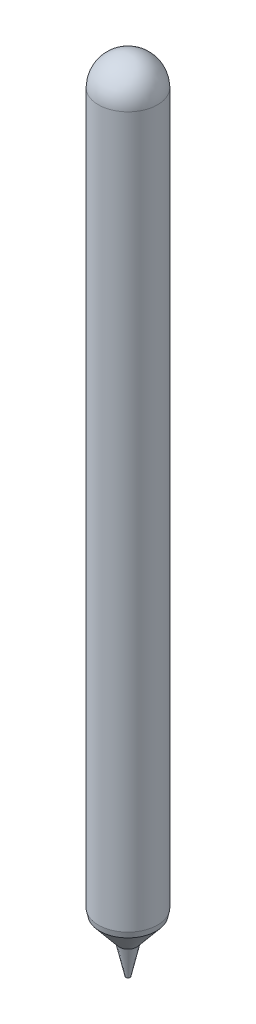
ISO-10303-21;
HEADER;
FILE_DESCRIPTION(('STEP AP214'),'2;1');
FILE_NAME('part.step','',(''),(''),'','','');
FILE_SCHEMA(('AUTOMOTIVE_DESIGN { 1 0 10303 214 1 1 1 1 }'));
ENDSEC;
DATA;
#1=APPLICATION_CONTEXT('core data for automotive mechanical design processes');
#2=APPLICATION_PROTOCOL_DEFINITION('international standard','automotive_design',2000,#1);
#3=PRODUCT_CONTEXT('',#1,'mechanical');
#4=PRODUCT('Part','Part','',(#3));
#5=PRODUCT_RELATED_PRODUCT_CATEGORY('part','',(#4));
#6=PRODUCT_DEFINITION_FORMATION('','',#4);
#7=PRODUCT_DEFINITION_CONTEXT('part definition',#1,'design');
#8=PRODUCT_DEFINITION('design','',#6,#7);
#9=PRODUCT_DEFINITION_SHAPE('','',#8);
#10=(LENGTH_UNIT() NAMED_UNIT(*) SI_UNIT(.MILLI.,.METRE.));
#11=(NAMED_UNIT(*) PLANE_ANGLE_UNIT() SI_UNIT($,.RADIAN.));
#12=(NAMED_UNIT(*) SI_UNIT($,.STERADIAN.) SOLID_ANGLE_UNIT());
#13=UNCERTAINTY_MEASURE_WITH_UNIT(LENGTH_MEASURE(1.E-05),#10,'distance_accuracy_value','');
#14=(GEOMETRIC_REPRESENTATION_CONTEXT(3) GLOBAL_UNCERTAINTY_ASSIGNED_CONTEXT((#13)) GLOBAL_UNIT_ASSIGNED_CONTEXT((#10,
#11,#12)) REPRESENTATION_CONTEXT('',''));
#15=CARTESIAN_POINT('',(0.,0.,0.));
#16=DIRECTION('',(0.,0.,1.));
#17=DIRECTION('',(1.,0.,0.));
#18=AXIS2_PLACEMENT_3D('',#15,#16,#17);
#19=CARTESIAN_POINT('',(-0.350000000000001,-126.075286940889,0.));
#20=DIRECTION('',(0.,-1.,0.));
#21=DIRECTION('',(1.,0.,0.));
#22=AXIS2_PLACEMENT_3D('',#19,#20,#21);
#23=PLANE('',#22);
#24=CARTESIAN_POINT('',(0.,-126.075286940889,0.));
#25=DIRECTION('',(0.,1.,0.));
#26=DIRECTION('',(-1.,0.,0.));
#27=AXIS2_PLACEMENT_3D('',#24,#25,#26);
#28=CIRCLE('',#27,0.35);
#29=CARTESIAN_POINT('',(-0.349999999999979,-126.075286940889,0.));
#30=VERTEX_POINT('',#29);
#31=EDGE_CURVE('E10',#30,#30,#28,.T.);
#32=ORIENTED_EDGE('',*,*,#31,.F.);
#33=EDGE_LOOP('',(#32));
#34=FACE_BOUND('',#33,.T.);
#35=ADVANCED_FACE('F31',(#34),#23,.T.);
#36=CARTESIAN_POINT('',(0.,3.92471305911135,0.));
#37=DIRECTION('',(0.,1.,0.));
#38=DIRECTION('',(1.,0.,0.));
#39=AXIS2_PLACEMENT_3D('',#36,#37,#38);
#40=SPHERICAL_SURFACE('',#39,5.);
#41=CARTESIAN_POINT('',(0.,3.92471305911135,0.));
#42=DIRECTION('',(0.,1.,0.));
#43=DIRECTION('',(-1.,0.,0.));
#44=AXIS2_PLACEMENT_3D('',#41,#42,#43);
#45=CIRCLE('',#44,5.);
#46=CARTESIAN_POINT('',(-5.,3.92471305911135,0.));
#47=VERTEX_POINT('',#46);
#48=EDGE_CURVE('E37',#47,#47,#45,.T.);
#49=ORIENTED_EDGE('',*,*,#48,.T.);
#50=EDGE_LOOP('',(#49));
#51=FACE_BOUND('',#50,.T.);
#52=ADVANCED_FACE('F66',(#51),#40,.T.);
#53=CARTESIAN_POINT('',(0.,3.92471305911135,0.));
#54=DIRECTION('',(0.,1.,0.));
#55=DIRECTION('',(-1.,0.,0.));
#56=AXIS2_PLACEMENT_3D('',#53,#54,#55);
#57=CYLINDRICAL_SURFACE('',#56,5.);
#58=CARTESIAN_POINT('',(0.,-116.075286940889,0.));
#59=DIRECTION('',(0.,1.,0.));
#60=DIRECTION('',(-1.,0.,0.));
#61=AXIS2_PLACEMENT_3D('',#58,#59,#60);
#62=CIRCLE('',#61,5.);
#63=CARTESIAN_POINT('',(-5.,-116.075286940889,0.));
#64=VERTEX_POINT('',#63);
#65=EDGE_CURVE('E41',#64,#64,#62,.T.);
#66=ORIENTED_EDGE('',*,*,#65,.T.);
#67=EDGE_LOOP('',(#66));
#68=FACE_BOUND('',#67,.T.);
#69=ORIENTED_EDGE('',*,*,#48,.F.);
#70=EDGE_LOOP('',(#69));
#71=FACE_BOUND('',#70,.T.);
#72=ADVANCED_FACE('F71',(#68,#71),#57,.T.);
#73=CARTESIAN_POINT('',(0.,-116.075286940889,0.));
#74=DIRECTION('',(0.,1.,0.));
#75=DIRECTION('',(-1.,0.,0.));
#76=AXIS2_PLACEMENT_3D('',#73,#74,#75);
#77=CONICAL_SURFACE('',#76,5.,0.212074559756631);
#78=CARTESIAN_POINT('',(0.,-117.075286940889,0.));
#79=DIRECTION('',(0.,1.,0.));
#80=DIRECTION('',(-1.,0.,0.));
#81=AXIS2_PLACEMENT_3D('',#78,#79,#80);
#82=CIRCLE('',#81,4.78468778669594);
#83=CARTESIAN_POINT('',(-4.78468778669593,-117.075286940889,0.));
#84=VERTEX_POINT('',#83);
#85=EDGE_CURVE('E45',#84,#84,#82,.T.);
#86=ORIENTED_EDGE('',*,*,#85,.T.);
#87=EDGE_LOOP('',(#86));
#88=FACE_BOUND('',#87,.T.);
#89=ORIENTED_EDGE('',*,*,#65,.F.);
#90=EDGE_LOOP('',(#89));
#91=FACE_BOUND('',#90,.T.);
#92=ADVANCED_FACE('F63',(#88,#91),#77,.T.);
#93=CARTESIAN_POINT('',(0.,-117.075286940889,0.));
#94=DIRECTION('',(0.,1.,0.));
#95=DIRECTION('',(-1.,0.,0.));
#96=AXIS2_PLACEMENT_3D('',#93,#94,#95);
#97=CONICAL_SURFACE('',#96,4.78468778669594,0.692491839591763);
#98=CARTESIAN_POINT('',(0.,-121.075286940889,0.));
#99=DIRECTION('',(0.,1.,0.));
#100=DIRECTION('',(-1.,0.,0.));
#101=AXIS2_PLACEMENT_3D('',#98,#99,#100);
#102=CIRCLE('',#101,1.46655187698664);
#103=CARTESIAN_POINT('',(-1.46655187698663,-121.075286940889,0.));
#104=VERTEX_POINT('',#103);
#105=EDGE_CURVE('E50',#104,#104,#102,.T.);
#106=CARTESIAN_POINT('',(-1.46655187698663,-121.075286940889,0.));
#107=CARTESIAN_POINT('',(-1.50111579271278,-121.033620274222,0.));
#108=CARTESIAN_POINT('',(-1.53567970843891,-120.991953607555,0.));
#109=CARTESIAN_POINT('',(-1.60480753989119,-120.908620274222,0.));
#110=CARTESIAN_POINT('',(-1.63937145561732,-120.866953607555,0.));
#111=CARTESIAN_POINT('',(-1.7084992870696,-120.783620274222,0.));
#112=CARTESIAN_POINT('',(-1.74306320279574,-120.741953607555,0.));
#113=CARTESIAN_POINT('',(-1.81219103424802,-120.658620274222,0.));
#114=CARTESIAN_POINT('',(-1.84675494997415,-120.616953607555,0.));
#115=CARTESIAN_POINT('',(-1.91588278142643,-120.533620274222,0.));
#116=CARTESIAN_POINT('',(-1.95044669715257,-120.491953607555,0.));
#117=CARTESIAN_POINT('',(-2.01957452860485,-120.408620274222,0.));
#118=CARTESIAN_POINT('',(-2.05413844433099,-120.366953607555,0.));
#119=CARTESIAN_POINT('',(-2.12326627578326,-120.283620274222,0.));
#120=CARTESIAN_POINT('',(-2.15783019150941,-120.241953607555,0.));
#121=CARTESIAN_POINT('',(-2.22695802296168,-120.158620274222,0.));
#122=CARTESIAN_POINT('',(-2.26152193868782,-120.116953607555,0.));
#123=CARTESIAN_POINT('',(-2.33064977014009,-120.033620274222,0.));
#124=CARTESIAN_POINT('',(-2.36521368586624,-119.991953607555,0.));
#125=CARTESIAN_POINT('',(-2.43434151731851,-119.908620274222,0.));
#126=CARTESIAN_POINT('',(-2.46890543304465,-119.866953607555,0.));
#127=CARTESIAN_POINT('',(-2.53803326449693,-119.783620274222,0.));
#128=CARTESIAN_POINT('',(-2.57259718022307,-119.741953607555,0.));
#129=CARTESIAN_POINT('',(-2.64172501167535,-119.658620274222,0.));
#130=CARTESIAN_POINT('',(-2.67628892740148,-119.616953607555,0.));
#131=CARTESIAN_POINT('',(-2.74541675885376,-119.533620274222,0.));
#132=CARTESIAN_POINT('',(-2.7799806745799,-119.491953607555,0.));
#133=CARTESIAN_POINT('',(-2.84910850603218,-119.408620274222,0.));
#134=CARTESIAN_POINT('',(-2.88367242175831,-119.366953607555,0.));
#135=CARTESIAN_POINT('',(-2.95280025321059,-119.283620274222,0.));
#136=CARTESIAN_POINT('',(-2.98736416893673,-119.241953607555,0.));
#137=CARTESIAN_POINT('',(-3.05649200038901,-119.158620274222,0.));
#138=CARTESIAN_POINT('',(-3.09105591611514,-119.116953607555,0.));
#139=CARTESIAN_POINT('',(-3.16018374756742,-119.033620274222,0.));
#140=CARTESIAN_POINT('',(-3.19474766329356,-118.991953607555,0.));
#141=CARTESIAN_POINT('',(-3.26387549474584,-118.908620274222,0.));
#142=CARTESIAN_POINT('',(-3.29843941047197,-118.866953607555,0.));
#143=CARTESIAN_POINT('',(-3.36756724192425,-118.783620274222,0.));
#144=CARTESIAN_POINT('',(-3.40213115765039,-118.741953607555,0.));
#145=CARTESIAN_POINT('',(-3.47125898910267,-118.658620274222,0.));
#146=CARTESIAN_POINT('',(-3.50582290482881,-118.616953607555,0.));
#147=CARTESIAN_POINT('',(-3.57495073628108,-118.533620274222,0.));
#148=CARTESIAN_POINT('',(-3.60951465200723,-118.491953607555,0.));
#149=CARTESIAN_POINT('',(-3.6786424834595,-118.408620274222,0.));
#150=CARTESIAN_POINT('',(-3.71320639918564,-118.366953607555,0.));
#151=CARTESIAN_POINT('',(-3.78233423063791,-118.283620274222,0.));
#152=CARTESIAN_POINT('',(-3.81689814636406,-118.241953607555,0.));
#153=CARTESIAN_POINT('',(-3.88602597781633,-118.158620274222,0.));
#154=CARTESIAN_POINT('',(-3.92058989354247,-118.116953607555,0.));
#155=CARTESIAN_POINT('',(-3.98971772499474,-118.033620274222,0.));
#156=CARTESIAN_POINT('',(-4.02428164072089,-117.991953607555,0.));
#157=CARTESIAN_POINT('',(-4.09340947217317,-117.908620274222,0.));
#158=CARTESIAN_POINT('',(-4.1279733878993,-117.866953607555,0.));
#159=CARTESIAN_POINT('',(-4.19710121935158,-117.783620274222,0.));
#160=CARTESIAN_POINT('',(-4.23166513507772,-117.741953607555,0.));
#161=CARTESIAN_POINT('',(-4.30079296653,-117.658620274222,0.));
#162=CARTESIAN_POINT('',(-4.33535688225613,-117.616953607555,0.));
#163=CARTESIAN_POINT('',(-4.40448471370841,-117.533620274222,0.));
#164=CARTESIAN_POINT('',(-4.43904862943455,-117.491953607555,0.));
#165=CARTESIAN_POINT('',(-4.50817646088683,-117.408620274222,0.));
#166=CARTESIAN_POINT('',(-4.54274037661296,-117.366953607555,0.));
#167=CARTESIAN_POINT('',(-4.61186820806524,-117.283620274222,0.));
#168=CARTESIAN_POINT('',(-4.64643212379138,-117.241953607555,0.));
#169=CARTESIAN_POINT('',(-4.71555995524366,-117.158620274222,0.));
#170=CARTESIAN_POINT('',(-4.7501238709698,-117.116953607555,0.));
#171=CARTESIAN_POINT('',(-4.78468778669593,-117.075286940889,0.));
#172=B_SPLINE_CURVE_WITH_KNOTS('',3,(#106,#107,#108,#109,#110,#111,#112,#113,#114,#115,#116,
#117,#118,#119,#120,#121,#122,#123,#124,#125,#126,#127,#128,#129,#130,#131,#132,#133,#134,#135,
#136,#137,#138,#139,#140,#141,#142,#143,#144,#145,#146,#147,#148,#149,#150,#151,#152,#153,#154,
#155,#156,#157,#158,#159,#160,#161,#162,#163,#164,#165,#166,#167,#168,#169,#170,#171),
.UNSPECIFIED.,.F.,.F.,(4,2,2,2,2,2,2,2,2,2,2,2,2,2,2,2,2,2,2,2,2,2,2,2,2,2,2,2,2,2,2,2,4),(0.,
0.162409908666033,0.324819817332087,0.487229725998119,0.649639634664173,0.812049543330205,
0.974459451996259,1.13686936066229,1.29927926932835,1.46168917799438,1.62409908666043,
1.78650899532647,1.94891890399252,2.11132881265855,2.27373872132461,2.43614862999064,
2.59855853865669,2.76096844732272,2.92337835598878,3.08578826465481,3.24819817332087,
3.4106080819869,3.57301799065295,3.73542789931898,3.89783780798504,4.06024771665107,
4.22265762531713,4.38506753398316,4.54747744264921,4.70988735131524,4.8722972599813,
5.03470716864733,5.19711707731339),.UNSPECIFIED.);
#173=EDGE_CURVE('BSEAM54',#104,#84,#172,.T.);
#174=ORIENTED_EDGE('',*,*,#105,.T.);
#175=ORIENTED_EDGE('',*,*,#85,.F.);
#176=ORIENTED_EDGE('',*,*,#173,.T.);
#177=ORIENTED_EDGE('',*,*,#173,.F.);
#178=EDGE_LOOP('',(#174,#176,#175,#177));
#179=FACE_BOUND('',#178,.T.);
#180=ADVANCED_FACE('F54',(#179),#97,.T.);
#181=CARTESIAN_POINT('',(0.,-121.075286940889,0.));
#182=DIRECTION('',(0.,1.,0.));
#183=DIRECTION('',(-1.,0.,0.));
#184=AXIS2_PLACEMENT_3D('',#181,#182,#183);
#185=CONICAL_SURFACE('',#184,1.46655187698664,0.219705652578468);
#186=CARTESIAN_POINT('',(-0.349999999999979,-126.075286940889,0.));
#187=CARTESIAN_POINT('',(-0.36163074871859,-126.023203607555,0.));
#188=CARTESIAN_POINT('',(-0.373261497437201,-125.971120274222,0.));
#189=CARTESIAN_POINT('',(-0.396522994874423,-125.866953607555,0.));
#190=CARTESIAN_POINT('',(-0.408153743593034,-125.814870274222,0.));
#191=CARTESIAN_POINT('',(-0.431415241030256,-125.710703607555,0.));
#192=CARTESIAN_POINT('',(-0.443045989748867,-125.658620274222,0.));
#193=CARTESIAN_POINT('',(-0.466307487186089,-125.554453607555,0.));
#194=CARTESIAN_POINT('',(-0.4779382359047,-125.502370274222,0.));
#195=CARTESIAN_POINT('',(-0.501199733341922,-125.398203607555,0.));
#196=CARTESIAN_POINT('',(-0.512830482060533,-125.346120274222,0.));
#197=CARTESIAN_POINT('',(-0.536091979497755,-125.241953607555,0.));
#198=CARTESIAN_POINT('',(-0.547722728216367,-125.189870274222,0.));
#199=CARTESIAN_POINT('',(-0.570984225653589,-125.085703607555,0.));
#200=CARTESIAN_POINT('',(-0.582614974372199,-125.033620274222,0.));
#201=CARTESIAN_POINT('',(-0.605876471809421,-124.929453607555,0.));
#202=CARTESIAN_POINT('',(-0.617507220528032,-124.877370274222,0.));
#203=CARTESIAN_POINT('',(-0.640768717965254,-124.773203607555,0.));
#204=CARTESIAN_POINT('',(-0.652399466683866,-124.721120274222,0.));
#205=CARTESIAN_POINT('',(-0.675660964121087,-124.616953607555,0.));
#206=CARTESIAN_POINT('',(-0.687291712839698,-124.564870274222,0.));
#207=CARTESIAN_POINT('',(-0.71055321027692,-124.460703607555,0.));
#208=CARTESIAN_POINT('',(-0.722183958995531,-124.408620274222,0.));
#209=CARTESIAN_POINT('',(-0.745445456432754,-124.304453607555,0.));
#210=CARTESIAN_POINT('',(-0.757076205151364,-124.252370274222,0.));
#211=CARTESIAN_POINT('',(-0.780337702588586,-124.148203607555,0.));
#212=CARTESIAN_POINT('',(-0.791968451307198,-124.096120274222,0.));
#213=CARTESIAN_POINT('',(-0.81522994874442,-123.991953607555,0.));
#214=CARTESIAN_POINT('',(-0.82686069746303,-123.939870274222,0.));
#215=CARTESIAN_POINT('',(-0.850122194900252,-123.835703607555,0.));
#216=CARTESIAN_POINT('',(-0.861752943618863,-123.783620274222,0.));
#217=CARTESIAN_POINT('',(-0.885014441056086,-123.679453607555,0.));
#218=CARTESIAN_POINT('',(-0.896645189774697,-123.627370274222,0.));
#219=CARTESIAN_POINT('',(-0.919906687211919,-123.523203607555,0.));
#220=CARTESIAN_POINT('',(-0.931537435930529,-123.471120274222,0.));
#221=CARTESIAN_POINT('',(-0.954798933367751,-123.366953607555,0.));
#222=CARTESIAN_POINT('',(-0.966429682086362,-123.314870274222,0.));
#223=CARTESIAN_POINT('',(-0.989691179523585,-123.210703607555,0.));
#224=CARTESIAN_POINT('',(-1.0013219282422,-123.158620274222,0.));
#225=CARTESIAN_POINT('',(-1.02458342567942,-123.054453607555,0.));
#226=CARTESIAN_POINT('',(-1.03621417439803,-123.002370274222,0.));
#227=CARTESIAN_POINT('',(-1.05947567183525,-122.898203607555,0.));
#228=CARTESIAN_POINT('',(-1.07110642055386,-122.846120274222,0.));
#229=CARTESIAN_POINT('',(-1.09436791799108,-122.741953607555,0.));
#230=CARTESIAN_POINT('',(-1.1059986667097,-122.689870274222,0.));
#231=CARTESIAN_POINT('',(-1.12926016414692,-122.585703607555,0.));
#232=CARTESIAN_POINT('',(-1.14089091286553,-122.533620274222,0.));
#233=CARTESIAN_POINT('',(-1.16415241030275,-122.429453607555,0.));
#234=CARTESIAN_POINT('',(-1.17578315902136,-122.377370274222,0.));
#235=CARTESIAN_POINT('',(-1.19904465645858,-122.273203607555,0.));
#236=CARTESIAN_POINT('',(-1.21067540517719,-122.221120274222,0.));
#237=CARTESIAN_POINT('',(-1.23393690261442,-122.116953607555,0.));
#238=CARTESIAN_POINT('',(-1.24556765133303,-122.064870274222,0.));
#239=CARTESIAN_POINT('',(-1.26882914877025,-121.960703607555,0.));
#240=CARTESIAN_POINT('',(-1.28045989748886,-121.908620274222,0.));
#241=CARTESIAN_POINT('',(-1.30372139492608,-121.804453607555,0.));
#242=CARTESIAN_POINT('',(-1.31535214364469,-121.752370274222,0.));
#243=CARTESIAN_POINT('',(-1.33861364108192,-121.648203607555,0.));
#244=CARTESIAN_POINT('',(-1.35024438980053,-121.596120274222,0.));
#245=CARTESIAN_POINT('',(-1.37350588723775,-121.491953607555,0.));
#246=CARTESIAN_POINT('',(-1.38513663595636,-121.439870274222,0.));
#247=CARTESIAN_POINT('',(-1.40839813339358,-121.335703607555,0.));
#248=CARTESIAN_POINT('',(-1.42002888211219,-121.283620274222,0.));
#249=CARTESIAN_POINT('',(-1.44329037954942,-121.179453607555,0.));
#250=CARTESIAN_POINT('',(-1.45492112826803,-121.127370274222,0.));
#251=CARTESIAN_POINT('',(-1.46655187698664,-121.075286940889,0.));
#252=B_SPLINE_CURVE_WITH_KNOTS('',3,(#186,#187,#188,#189,#190,#191,#192,#193,#194,#195,#196,
#197,#198,#199,#200,#201,#202,#203,#204,#205,#206,#207,#208,#209,#210,#211,#212,#213,#214,#215,
#216,#217,#218,#219,#220,#221,#222,#223,#224,#225,#226,#227,#228,#229,#230,#231,#232,#233,#234,
#235,#236,#237,#238,#239,#240,#241,#242,#243,#244,#245,#246,#247,#248,#249,#250,#251),
.UNSPECIFIED.,.F.,.F.,(4,2,2,2,2,2,2,2,2,2,2,2,2,2,2,2,2,2,2,2,2,2,2,2,2,2,2,2,2,2,2,2,4),(0.,
0.160098505120436,0.320197010240872,0.480295515361307,0.640394020481743,0.800492525602179,
0.960591030722615,1.12068953584306,1.2807880409635,1.44088654608394,1.60098505120439,
1.76108355632482,1.92118206144526,2.08128056656569,2.24137907168614,2.40147757680658,
2.56157608192701,2.72167458704746,2.8817730921679,3.04187159728833,3.20197010240877,
3.36206860752922,3.52216711264966,3.68226561777009,3.84236412289053,4.00246262801098,
4.16256113313141,4.32265963825185,4.48275814337229,4.64285664849273,4.80295515361317,
4.96305365873361,5.12315216385405),.UNSPECIFIED.);
#253=EDGE_CURVE('BSEAM57',#30,#104,#252,.T.);
#254=ORIENTED_EDGE('',*,*,#31,.T.);
#255=ORIENTED_EDGE('',*,*,#105,.F.);
#256=ORIENTED_EDGE('',*,*,#253,.T.);
#257=ORIENTED_EDGE('',*,*,#253,.F.);
#258=EDGE_LOOP('',(#254,#256,#255,#257));
#259=FACE_BOUND('',#258,.T.);
#260=ADVANCED_FACE('F57',(#259),#185,.T.);
#261=CLOSED_SHELL('',(#35,#52,#72,#92,#180,#260));
#262=MANIFOLD_SOLID_BREP('B2',#261);
#263=ADVANCED_BREP_SHAPE_REPRESENTATION('',(#18,#262),#14);
#264=SHAPE_DEFINITION_REPRESENTATION(#9,#263);
ENDSEC;
END-ISO-10303-21;
